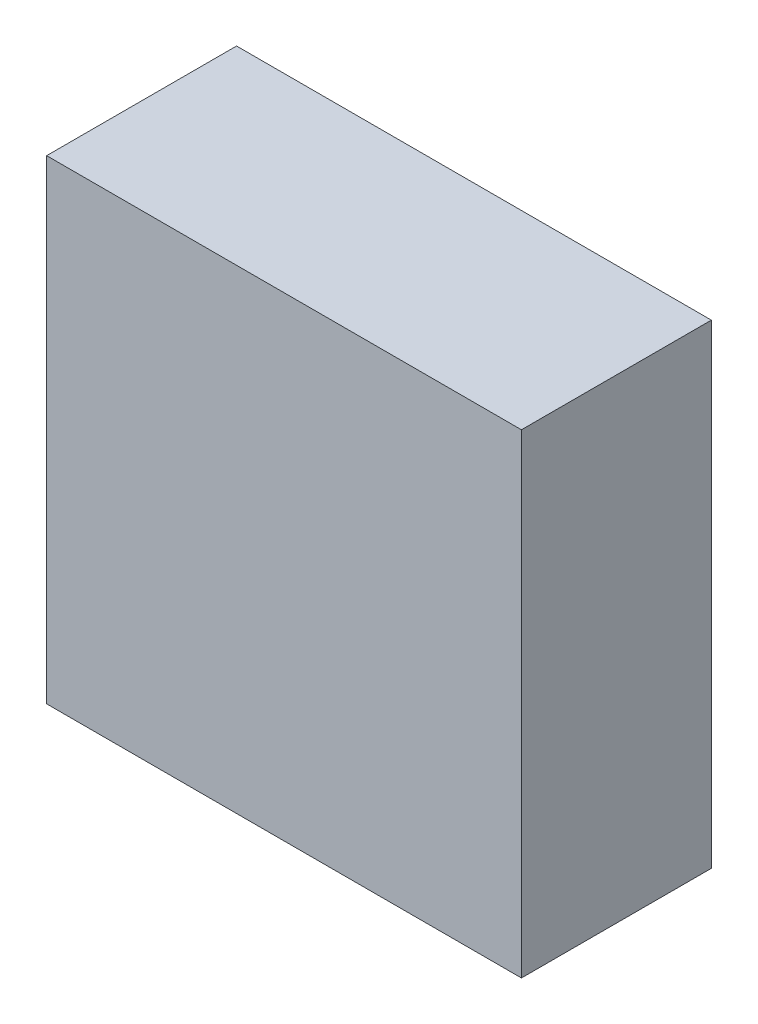
ISO-10303-21;
HEADER;
FILE_DESCRIPTION(('STEP AP214'),'2;1');
FILE_NAME('part.step','',(''),(''),'','','');
FILE_SCHEMA(('AUTOMOTIVE_DESIGN { 1 0 10303 214 1 1 1 1 }'));
ENDSEC;
DATA;
#1=APPLICATION_CONTEXT('core data for automotive mechanical design processes');
#2=APPLICATION_PROTOCOL_DEFINITION('international standard','automotive_design',2000,#1);
#3=PRODUCT_CONTEXT('',#1,'mechanical');
#4=PRODUCT('Part','Part','',(#3));
#5=PRODUCT_RELATED_PRODUCT_CATEGORY('part','',(#4));
#6=PRODUCT_DEFINITION_FORMATION('','',#4);
#7=PRODUCT_DEFINITION_CONTEXT('part definition',#1,'design');
#8=PRODUCT_DEFINITION('design','',#6,#7);
#9=PRODUCT_DEFINITION_SHAPE('','',#8);
#10=(LENGTH_UNIT() NAMED_UNIT(*) SI_UNIT(.MILLI.,.METRE.));
#11=(NAMED_UNIT(*) PLANE_ANGLE_UNIT() SI_UNIT($,.RADIAN.));
#12=(NAMED_UNIT(*) SI_UNIT($,.STERADIAN.) SOLID_ANGLE_UNIT());
#13=UNCERTAINTY_MEASURE_WITH_UNIT(LENGTH_MEASURE(1.E-05),#10,'distance_accuracy_value','');
#14=(GEOMETRIC_REPRESENTATION_CONTEXT(3) GLOBAL_UNCERTAINTY_ASSIGNED_CONTEXT((#13)) GLOBAL_UNIT_ASSIGNED_CONTEXT((#10,
#11,#12)) REPRESENTATION_CONTEXT('',''));
#15=CARTESIAN_POINT('',(0.,0.,0.));
#16=DIRECTION('',(0.,0.,1.));
#17=DIRECTION('',(1.,0.,0.));
#18=AXIS2_PLACEMENT_3D('',#15,#16,#17);
#19=CARTESIAN_POINT('',(-175.,885.,8.759753698094));
#20=DIRECTION('',(0.,0.,1.));
#21=DIRECTION('',(1.,0.,0.));
#22=AXIS2_PLACEMENT_3D('',#19,#20,#21);
#23=PLANE('',#22);
#24=DIRECTION('',(0.,1.,0.));
#25=VECTOR('',#24,1.);
#26=CARTESIAN_POINT('',(-175.,885.,8.759753698094));
#27=LINE('',#26,#25);
#28=CARTESIAN_POINT('',(-175.,885.,8.759753698094));
#29=VERTEX_POINT('',#28);
#30=CARTESIAN_POINT('',(-175.,915.,8.759753698094));
#31=VERTEX_POINT('',#30);
#32=EDGE_CURVE('E109',#29,#31,#27,.T.);
#33=ORIENTED_EDGE('',*,*,#32,.F.);
#34=DIRECTION('',(1.,0.,0.));
#35=VECTOR('',#34,1.);
#36=CARTESIAN_POINT('',(-175.,885.,8.759753698094));
#37=LINE('',#36,#35);
#38=CARTESIAN_POINT('',(-145.,885.,8.759753698094));
#39=VERTEX_POINT('',#38);
#40=EDGE_CURVE('E73',#29,#39,#37,.T.);
#41=ORIENTED_EDGE('',*,*,#40,.T.);
#42=DIRECTION('',(0.,1.,0.));
#43=VECTOR('',#42,1.);
#44=CARTESIAN_POINT('',(-145.,885.,8.759753698094));
#45=LINE('',#44,#43);
#46=CARTESIAN_POINT('',(-145.,915.,8.759753698094));
#47=VERTEX_POINT('',#46);
#48=EDGE_CURVE('E85',#39,#47,#45,.T.);
#49=ORIENTED_EDGE('',*,*,#48,.T.);
#50=DIRECTION('',(1.,0.,0.));
#51=VECTOR('',#50,1.);
#52=CARTESIAN_POINT('',(-175.,915.,8.759753698094));
#53=LINE('',#52,#51);
#54=EDGE_CURVE('E10',#31,#47,#53,.T.);
#55=ORIENTED_EDGE('',*,*,#54,.F.);
#56=EDGE_LOOP('',(#33,#41,#49,#55));
#57=FACE_BOUND('',#56,.T.);
#58=ADVANCED_FACE('F16',(#57),#23,.T.);
#59=CARTESIAN_POINT('',(-175.,885.,-3.240246301906));
#60=DIRECTION('',(0.,0.,1.));
#61=DIRECTION('',(1.,0.,0.));
#62=AXIS2_PLACEMENT_3D('',#59,#60,#61);
#63=PLANE('',#62);
#64=DIRECTION('',(1.,0.,0.));
#65=VECTOR('',#64,1.);
#66=CARTESIAN_POINT('',(-175.,915.,-3.240246301906));
#67=LINE('',#66,#65);
#68=CARTESIAN_POINT('',(-175.,915.,-3.240246301906));
#69=VERTEX_POINT('',#68);
#70=CARTESIAN_POINT('',(-145.,915.,-3.240246301906));
#71=VERTEX_POINT('',#70);
#72=EDGE_CURVE('E24',#69,#71,#67,.T.);
#73=ORIENTED_EDGE('',*,*,#72,.T.);
#74=DIRECTION('',(0.,1.,0.));
#75=VECTOR('',#74,1.);
#76=CARTESIAN_POINT('',(-145.,885.,-3.240246301906));
#77=LINE('',#76,#75);
#78=CARTESIAN_POINT('',(-145.,885.,-3.240246301906));
#79=VERTEX_POINT('',#78);
#80=EDGE_CURVE('E76',#79,#71,#77,.T.);
#81=ORIENTED_EDGE('',*,*,#80,.F.);
#82=DIRECTION('',(1.,0.,0.));
#83=VECTOR('',#82,1.);
#84=CARTESIAN_POINT('',(-175.,885.,-3.240246301906));
#85=LINE('',#84,#83);
#86=CARTESIAN_POINT('',(-175.,885.,-3.240246301906));
#87=VERTEX_POINT('',#86);
#88=EDGE_CURVE('E64',#87,#79,#85,.T.);
#89=ORIENTED_EDGE('',*,*,#88,.F.);
#90=DIRECTION('',(0.,1.,0.));
#91=VECTOR('',#90,1.);
#92=CARTESIAN_POINT('',(-175.,885.,-3.240246301906));
#93=LINE('',#92,#91);
#94=EDGE_CURVE('E92',#87,#69,#93,.T.);
#95=ORIENTED_EDGE('',*,*,#94,.T.);
#96=EDGE_LOOP('',(#73,#81,#89,#95));
#97=FACE_BOUND('',#96,.T.);
#98=ADVANCED_FACE('F77',(#97),#63,.F.);
#99=CARTESIAN_POINT('',(-175.,915.,-3.240246301906));
#100=DIRECTION('',(0.,1.,0.));
#101=DIRECTION('',(1.,0.,0.));
#102=AXIS2_PLACEMENT_3D('',#99,#100,#101);
#103=PLANE('',#102);
#104=ORIENTED_EDGE('',*,*,#72,.F.);
#105=DIRECTION('',(0.,0.,1.));
#106=VECTOR('',#105,1.);
#107=CARTESIAN_POINT('',(-175.,915.,-3.240246301906));
#108=LINE('',#107,#106);
#109=EDGE_CURVE('E96',#69,#31,#108,.T.);
#110=ORIENTED_EDGE('',*,*,#109,.T.);
#111=ORIENTED_EDGE('',*,*,#54,.T.);
#112=DIRECTION('',(0.,0.,1.));
#113=VECTOR('',#112,1.);
#114=CARTESIAN_POINT('',(-145.,915.,-3.240246301906));
#115=LINE('',#114,#113);
#116=EDGE_CURVE('E81',#71,#47,#115,.T.);
#117=ORIENTED_EDGE('',*,*,#116,.F.);
#118=EDGE_LOOP('',(#104,#110,#111,#117));
#119=FACE_BOUND('',#118,.T.);
#120=ADVANCED_FACE('F122',(#119),#103,.T.);
#121=CARTESIAN_POINT('',(-175.,885.,-3.240246301906));
#122=DIRECTION('',(0.,1.,0.));
#123=DIRECTION('',(1.,0.,0.));
#124=AXIS2_PLACEMENT_3D('',#121,#122,#123);
#125=PLANE('',#124);
#126=DIRECTION('',(0.,0.,1.));
#127=VECTOR('',#126,1.);
#128=CARTESIAN_POINT('',(-145.,885.,-3.240246301906));
#129=LINE('',#128,#127);
#130=EDGE_CURVE('E68',#79,#39,#129,.T.);
#131=ORIENTED_EDGE('',*,*,#130,.T.);
#132=ORIENTED_EDGE('',*,*,#40,.F.);
#133=DIRECTION('',(0.,0.,1.));
#134=VECTOR('',#133,1.);
#135=CARTESIAN_POINT('',(-175.,885.,-3.240246301906));
#136=LINE('',#135,#134);
#137=EDGE_CURVE('E70',#87,#29,#136,.T.);
#138=ORIENTED_EDGE('',*,*,#137,.F.);
#139=ORIENTED_EDGE('',*,*,#88,.T.);
#140=EDGE_LOOP('',(#131,#132,#138,#139));
#141=FACE_BOUND('',#140,.T.);
#142=ADVANCED_FACE('F65',(#141),#125,.F.);
#143=CARTESIAN_POINT('',(-145.,885.,-3.240246301906));
#144=DIRECTION('',(1.,0.,0.));
#145=DIRECTION('',(0.,1.,0.));
#146=AXIS2_PLACEMENT_3D('',#143,#144,#145);
#147=PLANE('',#146);
#148=ORIENTED_EDGE('',*,*,#130,.F.);
#149=ORIENTED_EDGE('',*,*,#80,.T.);
#150=ORIENTED_EDGE('',*,*,#116,.T.);
#151=ORIENTED_EDGE('',*,*,#48,.F.);
#152=EDGE_LOOP('',(#148,#149,#150,#151));
#153=FACE_BOUND('',#152,.T.);
#154=ADVANCED_FACE('F84',(#153),#147,.T.);
#155=CARTESIAN_POINT('',(-175.,885.,-3.240246301906));
#156=DIRECTION('',(1.,0.,0.));
#157=DIRECTION('',(0.,1.,0.));
#158=AXIS2_PLACEMENT_3D('',#155,#156,#157);
#159=PLANE('',#158);
#160=ORIENTED_EDGE('',*,*,#32,.T.);
#161=ORIENTED_EDGE('',*,*,#109,.F.);
#162=ORIENTED_EDGE('',*,*,#94,.F.);
#163=ORIENTED_EDGE('',*,*,#137,.T.);
#164=EDGE_LOOP('',(#160,#161,#162,#163));
#165=FACE_BOUND('',#164,.T.);
#166=ADVANCED_FACE('F113',(#165),#159,.F.);
#167=CLOSED_SHELL('',(#58,#98,#120,#142,#154,#166));
#168=MANIFOLD_SOLID_BREP('B1',#167);
#169=ADVANCED_BREP_SHAPE_REPRESENTATION('',(#18,#168),#14);
#170=SHAPE_DEFINITION_REPRESENTATION(#9,#169);
ENDSEC;
END-ISO-10303-21;
